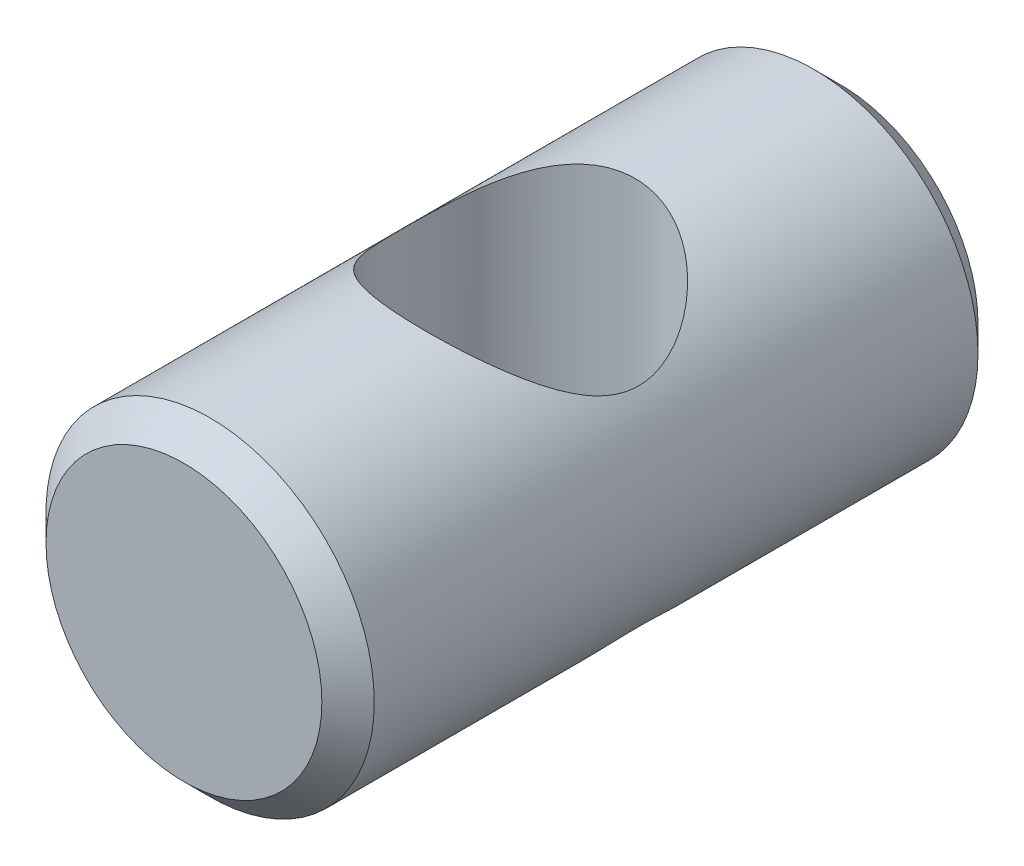
ISO-10303-21;
HEADER;
FILE_DESCRIPTION(('STEP AP214'),'2;1');
FILE_NAME('part.step','',(''),(''),'','','');
FILE_SCHEMA(('AUTOMOTIVE_DESIGN { 1 0 10303 214 1 1 1 1 }'));
ENDSEC;
DATA;
#1=APPLICATION_CONTEXT('core data for automotive mechanical design processes');
#2=APPLICATION_PROTOCOL_DEFINITION('international standard','automotive_design',2000,#1);
#3=PRODUCT_CONTEXT('',#1,'mechanical');
#4=PRODUCT('Part','Part','',(#3));
#5=PRODUCT_RELATED_PRODUCT_CATEGORY('part','',(#4));
#6=PRODUCT_DEFINITION_FORMATION('','',#4);
#7=PRODUCT_DEFINITION_CONTEXT('part definition',#1,'design');
#8=PRODUCT_DEFINITION('design','',#6,#7);
#9=PRODUCT_DEFINITION_SHAPE('','',#8);
#10=(LENGTH_UNIT() NAMED_UNIT(*) SI_UNIT(.MILLI.,.METRE.));
#11=(NAMED_UNIT(*) PLANE_ANGLE_UNIT() SI_UNIT($,.RADIAN.));
#12=(NAMED_UNIT(*) SI_UNIT($,.STERADIAN.) SOLID_ANGLE_UNIT());
#13=UNCERTAINTY_MEASURE_WITH_UNIT(LENGTH_MEASURE(1.E-05),#10,'distance_accuracy_value','');
#14=(GEOMETRIC_REPRESENTATION_CONTEXT(3) GLOBAL_UNCERTAINTY_ASSIGNED_CONTEXT((#13)) GLOBAL_UNIT_ASSIGNED_CONTEXT((#10,
#11,#12)) REPRESENTATION_CONTEXT('',''));
#15=CARTESIAN_POINT('',(0.,0.,0.));
#16=DIRECTION('',(0.,0.,1.));
#17=DIRECTION('',(1.,0.,0.));
#18=AXIS2_PLACEMENT_3D('',#15,#16,#17);
#19=CARTESIAN_POINT('',(0.,0.,9.525));
#20=DIRECTION('',(0.,0.,-1.));
#21=DIRECTION('',(-1.,0.,0.));
#22=AXIS2_PLACEMENT_3D('',#19,#20,#21);
#23=CYLINDRICAL_SURFACE('',#22,4.765);
#24=CARTESIAN_POINT('',(0.,-4.765,-3.42087708051605));
#25=CARTESIAN_POINT('',(-0.0856942510059222,-4.76500372406179,-3.41461845405845));
#26=CARTESIAN_POINT('',(-0.171121100206974,-4.76268528674186,-3.40513185664893));
#27=CARTESIAN_POINT('',(-0.340815163949196,-4.75355458297263,-3.3798209799213));
#28=CARTESIAN_POINT('',(-0.425082157083863,-4.74674147034843,-3.36399550745666));
#29=CARTESIAN_POINT('',(-0.591815819068765,-4.72884919919637,-3.32619287103985));
#30=CARTESIAN_POINT('',(-0.674281275080604,-4.71776725496124,-3.30421169262714));
#31=CARTESIAN_POINT('',(-0.836795481484615,-4.69167199758972,-3.25438345334717));
#32=CARTESIAN_POINT('',(-0.916843174546032,-4.67665699144282,-3.22653386740008));
#33=CARTESIAN_POINT('',(-1.15161088782801,-4.62649388533987,-3.13503201933925));
#34=CARTESIAN_POINT('',(-1.30210455493484,-4.58609564145861,-3.06316075101044));
#35=CARTESIAN_POINT('',(-1.58863168547318,-4.49490342184667,-2.90027011950621));
#36=CARTESIAN_POINT('',(-1.72466521273604,-4.44410949200855,-2.8092508408611));
#37=CARTESIAN_POINT('',(-1.99344316901954,-4.33066983387455,-2.60068581749612));
#38=CARTESIAN_POINT('',(-2.12455950948192,-4.26735049915497,-2.48141483397178));
#39=CARTESIAN_POINT('',(-2.36662844877739,-4.13801271400532,-2.22471339631872));
#40=CARTESIAN_POINT('',(-2.47754400950904,-4.07198957219361,-2.0872503679407));
#41=CARTESIAN_POINT('',(-2.63522008426459,-3.97058736699203,-1.85762881960823));
#42=CARTESIAN_POINT('',(-2.68927381649975,-3.93405791672857,-1.77089868261764));
#43=CARTESIAN_POINT('',(-2.7898123672948,-3.86341055651136,-1.59215475247703));
#44=CARTESIAN_POINT('',(-2.8362953611804,-3.82929322903742,-1.50013969277935));
#45=CARTESIAN_POINT('',(-2.92109506219807,-3.76500433588578,-1.31138394914416));
#46=CARTESIAN_POINT('',(-2.95943224889948,-3.73482295044036,-1.21465588622808));
#47=CARTESIAN_POINT('',(-3.02751038617565,-3.67985289464928,-1.01675067628099));
#48=CARTESIAN_POINT('',(-3.05725266863841,-3.65506338891177,-0.915574221386684));
#49=CARTESIAN_POINT('',(-3.11687147939033,-3.6045001534632,-0.67099477241958));
#50=CARTESIAN_POINT('',(-3.1426716573391,-3.58179904614131,-0.525900399043322));
#51=CARTESIAN_POINT('',(-3.17531879928658,-3.55289761873413,-0.232127458475882));
#52=CARTESIAN_POINT('',(-3.18219321735307,-3.54667339746892,-0.0834543989750653));
#53=CARTESIAN_POINT('',(-3.17657749143383,-3.55170212546434,0.213317287341349));
#54=CARTESIAN_POINT('',(-3.16407499232303,-3.56296622565023,0.361415487241703));
#55=CARTESIAN_POINT('',(-3.12052786613102,-3.60115736376545,0.652864674015799));
#56=CARTESIAN_POINT('',(-3.08945551925451,-3.62810781563299,0.796208225157674));
#57=CARTESIAN_POINT('',(-2.99939551024929,-3.7031254731471,1.113834133153));
#58=CARTESIAN_POINT('',(-2.935059493251,-3.75497411677657,1.28568810104235));
#59=CARTESIAN_POINT('',(-2.78193078819236,-3.86978306225472,1.61407604920641));
#60=CARTESIAN_POINT('',(-2.69310335851004,-3.93275910264603,1.77058783551896));
#61=CARTESIAN_POINT('',(-2.4912979885232,-4.06367063457592,2.0696195035013));
#62=CARTESIAN_POINT('',(-2.37789966570814,-4.13167682450423,2.21182316788456));
#63=CARTESIAN_POINT('',(-2.12925717522725,-4.2651343082136,2.47731111793097));
#64=CARTESIAN_POINT('',(-1.99400822055652,-4.33058503823793,2.60059124628564));
#65=CARTESIAN_POINT('',(-1.7670573834392,-4.42612763761141,2.77615470390877));
#66=CARTESIAN_POINT('',(-1.6822445834248,-4.45914566450104,2.83587617597991));
#67=CARTESIAN_POINT('',(-1.50659920639215,-4.52150995180942,2.947896944092));
#68=CARTESIAN_POINT('',(-1.41576961857281,-4.55085801488201,3.00019988575807));
#69=CARTESIAN_POINT('',(-1.22866881482431,-4.60489675490913,3.09669333580216));
#70=CARTESIAN_POINT('',(-1.13240204741352,-4.62959116958818,3.14089035393789));
#71=CARTESIAN_POINT('',(-0.935098556820256,-4.67343743710795,3.22051991832548));
#72=CARTESIAN_POINT('',(-0.834063119610056,-4.69259077439564,3.25595481156827));
#73=CARTESIAN_POINT('',(-0.643011205494899,-4.72225783820339,3.31298838642537));
#74=CARTESIAN_POINT('',(-0.553499932720004,-4.73361796210781,3.33584407298325));
#75=CARTESIAN_POINT('',(-0.372452914467137,-4.75129170146378,3.37431676551974));
#76=CARTESIAN_POINT('',(-0.280917553453982,-4.75760626697296,3.38993513402243));
#77=CARTESIAN_POINT('',(-0.09673711161572,-4.76490794866924,3.41369053940287));
#78=CARTESIAN_POINT('',(-0.00409298485153118,-4.7658993553638,3.42183359704886));
#79=CARTESIAN_POINT('',(0.181418156766346,-4.76245075257906,3.43057334885341));
#80=CARTESIAN_POINT('',(0.274285147372989,-4.75801130940609,3.4311708297596));
#81=CARTESIAN_POINT('',(0.525402140212855,-4.73860365154558,3.42259332577953));
#82=CARTESIAN_POINT('',(0.683080399868527,-4.71838660580482,3.40615014047491));
#83=CARTESIAN_POINT('',(0.992055912085098,-4.66323470196912,3.35244843254439));
#84=CARTESIAN_POINT('',(1.14335212857024,-4.62829746420291,3.31518654404212));
#85=CARTESIAN_POINT('',(1.44037093529811,-4.54477683855939,3.22069256193487));
#86=CARTESIAN_POINT('',(1.58583077351322,-4.49584879234044,3.16294586849736));
#87=CARTESIAN_POINT('',(1.86441880924205,-4.38765715004444,3.03024615278744));
#88=CARTESIAN_POINT('',(1.99754518152055,-4.32839202790804,2.95529058945734));
#89=CARTESIAN_POINT('',(2.27097103888529,-4.19224174473938,2.77694263666353));
#90=CARTESIAN_POINT('',(2.40888984782925,-4.11405974263684,2.67090512984919));
#91=CARTESIAN_POINT('',(2.66587906112291,-3.95239056473024,2.44095262310581));
#92=CARTESIAN_POINT('',(2.78491038380749,-3.86889287710437,2.3170015431911));
#93=CARTESIAN_POINT('',(2.95944836917975,-3.73546390997119,2.10578327830163));
#94=CARTESIAN_POINT('',(3.02130520302377,-3.68548107882744,2.0237036190676));
#95=CARTESIAN_POINT('',(3.13777568238829,-3.58683785296792,1.85371866080111));
#96=CARTESIAN_POINT('',(3.19238662314116,-3.53817795744017,1.76581120461187));
#97=CARTESIAN_POINT('',(3.29391986716952,-3.44385098338172,1.5843730656778));
#98=CARTESIAN_POINT('',(3.34085609211771,-3.39817857804186,1.49085299510459));
#99=CARTESIAN_POINT('',(3.42662377857565,-3.31167359664885,1.29810668122894));
#100=CARTESIAN_POINT('',(3.46546161115912,-3.27083722705749,1.19888500242191));
#101=CARTESIAN_POINT('',(3.54120497188103,-3.18885516595158,0.974440490747446));
#102=CARTESIAN_POINT('',(3.57619062301583,-3.1492626339122,0.847970637553341));
#103=CARTESIAN_POINT('',(3.63174972945767,-3.08503730320172,0.588391612874332));
#104=CARTESIAN_POINT('',(3.65235728655054,-3.06036912574003,0.455298958800161));
#105=CARTESIAN_POINT('',(3.67777071315275,-3.02979706874601,0.184194545370656));
#106=CARTESIAN_POINT('',(3.68244175304891,-3.02405331165103,0.0461507501936488));
#107=CARTESIAN_POINT('',(3.6751244389998,-3.03293601525137,-0.228869006794241));
#108=CARTESIAN_POINT('',(3.66312499986099,-3.0475760303441,-0.365844197101763));
#109=CARTESIAN_POINT('',(3.62122925120973,-3.09726630105768,-0.650230171928317));
#110=CARTESIAN_POINT('',(3.58937336547909,-3.13453780226407,-0.796943421401725));
#111=CARTESIAN_POINT('',(3.508654337231,-3.22462114118857,-1.08072293758561));
#112=CARTESIAN_POINT('',(3.45974705679342,-3.27747325429306,-1.21776304727642));
#113=CARTESIAN_POINT('',(3.36301407675573,-3.37619758620276,-1.44380487587525));
#114=CARTESIAN_POINT('',(3.31880941649885,-3.41980345352406,-1.53541472914784));
#115=CARTESIAN_POINT('',(3.22318686460508,-3.51007278340862,-1.71325899124101));
#116=CARTESIAN_POINT('',(3.17176598967204,-3.55673750627696,-1.79949115543573));
#117=CARTESIAN_POINT('',(3.06199483422709,-3.65166911402979,-1.96661914900773));
#118=CARTESIAN_POINT('',(3.00363765010073,-3.69993756007587,-2.04750953513389));
#119=CARTESIAN_POINT('',(2.88022236229035,-3.79680115463074,-2.20380218805043));
#120=CARTESIAN_POINT('',(2.81516393657853,-3.84539631873498,-2.27920419079938));
#121=CARTESIAN_POINT('',(2.67676457623467,-3.94303263591416,-2.4261391389075));
#122=CARTESIAN_POINT('',(2.60325744667227,-3.99205464797062,-2.49752854458933));
#123=CARTESIAN_POINT('',(2.44945432768786,-4.0882302310309,-2.63398346451988));
#124=CARTESIAN_POINT('',(2.36915847098096,-4.13538383853433,-2.69904910234064));
#125=CARTESIAN_POINT('',(2.20207272913392,-4.22671789334807,-2.82224391386082));
#126=CARTESIAN_POINT('',(2.11529478200157,-4.27090353485644,-2.88038535111654));
#127=CARTESIAN_POINT('',(1.9354015778796,-4.35537950017704,-2.98921049190835));
#128=CARTESIAN_POINT('',(1.84228618810119,-4.3956697423259,-3.03989403910843));
#129=CARTESIAN_POINT('',(1.60007775045864,-4.49105515072698,-3.15729530247129));
#130=CARTESIAN_POINT('',(1.44704004279908,-4.54296413284264,-3.21865913496703));
#131=CARTESIAN_POINT('',(1.12993645286048,-4.63200684267677,-3.3193657103388));
#132=CARTESIAN_POINT('',(0.965887162825332,-4.66916224170543,-3.35874078699293));
#133=CARTESIAN_POINT('',(0.667836753392529,-4.7198321934562,-3.40702933763492));
#134=CARTESIAN_POINT('',(0.535175413725972,-4.73675120565746,-3.42074184495159));
#135=CARTESIAN_POINT('',(0.268125701070823,-4.75933258257015,-3.43254995015108));
#136=CARTESIAN_POINT('',(0.133737212222471,-4.76499418810905,-3.43064449484029));
#137=CARTESIAN_POINT('',(0.,-4.765,-3.42087708051605));
#138=B_SPLINE_CURVE_WITH_KNOTS('',3,(#24,#25,#26,#27,#28,#29,#30,#31,#32,#33,#34,#35,#36,#37,
#38,#39,#40,#41,#42,#43,#44,#45,#46,#47,#48,#49,#50,#51,#52,#53,#54,#55,#56,#57,#58,#59,#60,#61,
#62,#63,#64,#65,#66,#67,#68,#69,#70,#71,#72,#73,#74,#75,#76,#77,#78,#79,#80,#81,#82,#83,#84,#85,
#86,#87,#88,#89,#90,#91,#92,#93,#94,#95,#96,#97,#98,#99,#100,#101,#102,#103,#104,#105,#106,#107,
#108,#109,#110,#111,#112,#113,#114,#115,#116,#117,#118,#119,#120,#121,#122,#123,#124,#125,#126,
#127,#128,#129,#130,#131,#132,#133,#134,#135,#136,#137),.UNSPECIFIED.,.T.,.F.,(4,2,2,2,2,2,2,2,
2,2,2,2,2,2,2,2,2,2,2,2,2,2,2,2,2,2,2,2,2,2,2,2,2,2,2,2,2,2,2,2,2,2,2,2,2,2,2,2,2,2,2,2,2,2,2,2,
4),(0.,0.257622698048237,0.515293910411776,0.773133556664686,1.03108437448132,1.54347148068929,
2.05585632497401,2.61844275267492,3.18205051961308,3.50728342339531,3.83259459810832,
4.1570779608603,4.48151101385633,4.92678697222646,5.37141666361017,5.81632997678325,
6.26190909071532,6.83091206396529,7.40072637063391,7.98119155491015,8.5617840795358,
8.88795315539233,9.21396138526207,9.53970664481247,9.86536455667517,10.1441842796833,
10.4229514897185,10.7014939774448,10.9800074224004,11.4570142229675,11.9340981662222,
12.4241316247447,12.9142374880829,13.4844043505898,14.0557360264669,14.3982708931589,
14.7409332646616,15.0829669920992,15.4247306149621,15.8344527346029,16.2431997463018,
16.655396466846,17.0678674127493,17.5294161680566,17.9921686334037,18.3237849761703,
18.6555388204231,18.9876256640975,19.3197284736399,19.6601202402325,20.0005053539297,
20.3402783466007,20.6800584607475,21.1964020749097,21.7119844090775,22.1140115905448,
22.5160658828429),.UNSPECIFIED.);
#139=CARTESIAN_POINT('',(0.,-4.765,-3.42087708051605));
#140=VERTEX_POINT('',#139);
#141=EDGE_CURVE('E10',#140,#140,#138,.T.);
#142=ORIENTED_EDGE('',*,*,#141,.T.);
#143=EDGE_LOOP('',(#142));
#144=FACE_BOUND('',#143,.T.);
#145=CARTESIAN_POINT('',(0.25,4.75843724346555,3.43));
#146=CARTESIAN_POINT('',(0.166724112169052,4.76281167621829,3.42999922787093));
#147=CARTESIAN_POINT('',(0.0833091871232495,4.76499730659661,3.42696170981832));
#148=CARTESIAN_POINT('',(-0.0831121740296209,4.7650026918208,3.4148068467804));
#149=CARTESIAN_POINT('',(-0.166118334391627,4.76281982101014,3.40568584755888));
#150=CARTESIAN_POINT('',(-0.331186959790398,4.75419585970188,3.38143299325718));
#151=CARTESIAN_POINT('',(-0.413247381645857,4.74774685395692,3.36628998600944));
#152=CARTESIAN_POINT('',(-0.57566379669092,4.7308054983668,3.33018248201757));
#153=CARTESIAN_POINT('',(-0.656019036141793,4.72031139819935,3.30921546630946));
#154=CARTESIAN_POINT('',(-0.892787966377315,4.68332033908369,3.23819654976144));
#155=CARTESIAN_POINT('',(-1.04595137150619,4.65125389258668,3.17986930590837));
#156=CARTESIAN_POINT('',(-1.33984014973707,4.57527843427845,3.04361904551389));
#157=CARTESIAN_POINT('',(-1.48056835886066,4.5313721320163,2.96570051271122));
#158=CARTESIAN_POINT('',(-1.75788689740451,4.43151908585651,2.78614227044201));
#159=CARTESIAN_POINT('',(-1.89336529725832,4.37491413457117,2.68315702445496));
#160=CARTESIAN_POINT('',(-2.14655524443234,4.25642076403591,2.45967503555252));
#161=CARTESIAN_POINT('',(-2.26424375736879,4.1945256545925,2.33915597919725));
#162=CARTESIAN_POINT('',(-2.49954291256701,4.05942448373215,2.06004986641745));
#163=CARTESIAN_POINT('',(-2.61358783923186,3.98612152048065,1.89848678532065));
#164=CARTESIAN_POINT('',(-2.8134167940547,3.84768475167639,1.55552772477578));
#165=CARTESIAN_POINT('',(-2.8992289351292,3.78254285998121,1.37415171538823));
#166=CARTESIAN_POINT('',(-3.02121659224799,3.68536960684574,1.04249027419633));
#167=CARTESIAN_POINT('',(-3.06446847823432,3.64913089405156,0.896059930245661));
#168=CARTESIAN_POINT('',(-3.13130443601069,3.59195313084762,0.59599414502253));
#169=CARTESIAN_POINT('',(-3.15492488386826,3.57098579230857,0.442372589402983));
#170=CARTESIAN_POINT('',(-3.18107400515714,3.54772325730842,0.130968163534104));
#171=CARTESIAN_POINT('',(-3.18348141023251,3.54553541923722,-0.0268334663617299));
#172=CARTESIAN_POINT('',(-3.16668321345997,3.56054009581889,-0.340378540732283));
#173=CARTESIAN_POINT('',(-3.14746550747579,3.57774346424277,-0.4961207831265));
#174=CARTESIAN_POINT('',(-3.0909210961652,3.62666135115865,-0.789904337023396));
#175=CARTESIAN_POINT('',(-3.05498661482471,3.65725103780533,-0.928415250197683));
#176=CARTESIAN_POINT('',(-2.96728528802359,3.72875878634848,-1.19751261050963));
#177=CARTESIAN_POINT('',(-2.91550550146166,3.76968528568752,-1.3280924753778));
#178=CARTESIAN_POINT('',(-2.77052705474689,3.87825771410624,-1.63782460440973));
#179=CARTESIAN_POINT('',(-2.66921327673824,3.9495685015488,-1.81191316545693));
#180=CARTESIAN_POINT('',(-2.4387535532021,4.09590072272998,-2.13907509935082));
#181=CARTESIAN_POINT('',(-2.30955797140353,4.17092858781235,-2.29211018589258));
#182=CARTESIAN_POINT('',(-2.02402160906534,4.31676779733467,-2.57575490113864));
#183=CARTESIAN_POINT('',(-1.86747364912315,4.38754097750563,-2.70617703034937));
#184=CARTESIAN_POINT('',(-1.53024851972964,4.51618771874562,-2.93894144764791));
#185=CARTESIAN_POINT('',(-1.34962456620741,4.57408899880651,-3.04134418612298));
#186=CARTESIAN_POINT('',(-1.01242767734236,4.65865916827853,-3.19328266988702));
#187=CARTESIAN_POINT('',(-0.85992332344972,4.68945201631652,-3.24956507034397));
#188=CARTESIAN_POINT('',(-0.546356902825548,4.73621910160439,-3.34025251275025));
#189=CARTESIAN_POINT('',(-0.385300834260464,4.75220358398007,-3.37467267483606));
#190=CARTESIAN_POINT('',(-0.0585909892563556,4.76745293508549,-3.42008033355065));
#191=CARTESIAN_POINT('',(0.107075469726218,4.76666592499011,-3.43099500658852));
#192=CARTESIAN_POINT('',(0.437263524427023,4.74777547003753,-3.42886170148299));
#193=CARTESIAN_POINT('',(0.601785009912756,4.72967038048901,-3.41581144729144));
#194=CARTESIAN_POINT('',(0.917023455984583,4.67852691536303,-3.36811701365221));
#195=CARTESIAN_POINT('',(1.06802543846496,4.64623395849401,-3.33452146005276));
#196=CARTESIAN_POINT('',(1.36114282577409,4.56897312306875,-3.2486320258752));
#197=CARTESIAN_POINT('',(1.5032561767415,4.52400232821754,-3.19633384236941));
#198=CARTESIAN_POINT('',(1.78918123830801,4.41920416422592,-3.06961312822602));
#199=CARTESIAN_POINT('',(1.93190566387653,4.35837989651048,-2.99357734594169));
#200=CARTESIAN_POINT('',(2.20254689954151,4.22807467175417,-2.82452841204479));
#201=CARTESIAN_POINT('',(2.3304539546229,4.15858807365445,-2.73150417873574));
#202=CARTESIAN_POINT('',(2.59396805594881,4.00055978130538,-2.51111133608925));
#203=CARTESIAN_POINT('',(2.72627669731259,3.9109325153004,-2.38058009592622));
#204=CARTESIAN_POINT('',(2.96812567159531,3.73070877587188,-2.100243948315));
#205=CARTESIAN_POINT('',(3.07764472575726,3.64011147895989,-1.95042123769023));
#206=CARTESIAN_POINT('',(3.25959426369705,3.47751484837525,-1.65330676505373));
#207=CARTESIAN_POINT('',(3.33502083401563,3.40464496946818,-1.50833136837071));
#208=CARTESIAN_POINT('',(3.46586658517559,3.2713441238456,-1.20430907278381));
#209=CARTESIAN_POINT('',(3.52132872734755,3.21088656913652,-1.04529331737332));
#210=CARTESIAN_POINT('',(3.59765604252707,3.124823861218,-0.757665304054352));
#211=CARTESIAN_POINT('',(3.62377560920146,3.09423907936361,-0.631975559150281));
#212=CARTESIAN_POINT('',(3.66180814769204,3.04914510271432,-0.375721470658428));
#213=CARTESIAN_POINT('',(3.67374715513707,3.03460645057289,-0.245166515787295));
#214=CARTESIAN_POINT('',(3.68248381420053,3.02400445245463,0.0177966534529435));
#215=CARTESIAN_POINT('',(3.67921741545453,3.02801925946825,0.150210360703107));
#216=CARTESIAN_POINT('',(3.65769938197026,3.0539665857314,0.412078573372208));
#217=CARTESIAN_POINT('',(3.63942784679228,3.07592289956546,0.54152891416466));
#218=CARTESIAN_POINT('',(3.58281700309049,3.14180670904453,0.826729712346176));
#219=CARTESIAN_POINT('',(3.54052764492096,3.18993005386834,0.980691312065217));
#220=CARTESIAN_POINT('',(3.43738681858182,3.30080253377366,1.2767906566915));
#221=CARTESIAN_POINT('',(3.37648537626474,3.36359093675505,1.41889524108079));
#222=CARTESIAN_POINT('',(3.25927230939949,3.4766169791788,1.64936888169118));
#223=CARTESIAN_POINT('',(3.20719498221027,3.52486634365835,1.7409394575126));
#224=CARTESIAN_POINT('',(3.09541954727663,3.62341667346676,1.91819495195357));
#225=CARTESIAN_POINT('',(3.03571875143679,3.67371835818199,2.0038777780348));
#226=CARTESIAN_POINT('',(2.90891804374965,3.77491865704642,2.16931406665596));
#227=CARTESIAN_POINT('',(2.84181267646787,3.82581768629146,2.24906308395903));
#228=CARTESIAN_POINT('',(2.70038920437342,3.92691720618762,2.40236682455076));
#229=CARTESIAN_POINT('',(2.62607150215374,3.9771177356504,2.47592189315842));
#230=CARTESIAN_POINT('',(2.46949972376397,4.0762079661732,2.61724277483524));
#231=CARTESIAN_POINT('',(2.38716864979552,4.1250776725309,2.68493753880603));
#232=CARTESIAN_POINT('',(2.21541256265412,4.21980975535666,2.81310096557156));
#233=CARTESIAN_POINT('',(2.1259865725645,4.26567171608716,2.87356863036593));
#234=CARTESIAN_POINT('',(1.94048293416797,4.35318701528819,2.98645656939565));
#235=CARTESIAN_POINT('',(1.8444179349447,4.39484800441004,3.03889156631573));
#236=CARTESIAN_POINT('',(1.64605779138663,4.47292957405361,3.1349771488852));
#237=CARTESIAN_POINT('',(1.54376590080899,4.50935285855684,3.17863227184576));
#238=CARTESIAN_POINT('',(1.28981920639204,4.58975257088417,3.27242101077825));
#239=CARTESIAN_POINT('',(1.1352862763967,4.63059676914717,3.31773285408371));
#240=CARTESIAN_POINT('',(0.897902839073421,4.68033819384841,3.36922808334745));
#241=CARTESIAN_POINT('',(0.817919413239364,4.69498977614935,3.38364210754006));
#242=CARTESIAN_POINT('',(0.65651498283896,4.7202607906775,3.4067980569507));
#243=CARTESIAN_POINT('',(0.575094809436486,4.73088247904069,3.41554315786432));
#244=CARTESIAN_POINT('',(0.452884075948464,4.74360353870641,3.42423436805334));
#245=CARTESIAN_POINT('',(0.412398045833619,4.74729478081944,3.42639368476122));
#246=CARTESIAN_POINT('',(0.331285742741573,4.75364382663165,3.42927683030824));
#247=CARTESIAN_POINT('',(0.29065944377002,4.7563014271186,3.43000037699194));
#248=CARTESIAN_POINT('',(0.25,4.75843724346555,3.43));
#249=B_SPLINE_CURVE_WITH_KNOTS('',3,(#145,#146,#147,#148,#149,#150,#151,#152,#153,#154,#155,
#156,#157,#158,#159,#160,#161,#162,#163,#164,#165,#166,#167,#168,#169,#170,#171,#172,#173,#174,
#175,#176,#177,#178,#179,#180,#181,#182,#183,#184,#185,#186,#187,#188,#189,#190,#191,#192,#193,
#194,#195,#196,#197,#198,#199,#200,#201,#202,#203,#204,#205,#206,#207,#208,#209,#210,#211,#212,
#213,#214,#215,#216,#217,#218,#219,#220,#221,#222,#223,#224,#225,#226,#227,#228,#229,#230,#231,
#232,#233,#234,#235,#236,#237,#238,#239,#240,#241,#242,#243,#244,#245,#246,#247,#248),
.UNSPECIFIED.,.T.,.F.,(4,2,2,2,2,2,2,2,2,2,2,2,2,2,2,2,2,2,2,2,2,2,2,2,2,2,2,2,2,2,2,2,2,2,2,2,
2,2,2,2,2,2,2,2,2,2,2,2,2,2,2,4),(0.,0.250128749904401,0.500407883064132,0.751152683255352,
1.00200610335284,1.5005745207861,1.99902893760549,2.53506428284883,3.0717878497701,
3.7017577007417,4.33109834451233,4.80006775596797,5.26816624101772,5.73893897524922,
6.20997534433429,6.64735102377689,7.08508487226794,7.72280008470008,8.36166008801208,
9.005587331222,9.64811417987125,10.1423678843309,10.636279384842,11.1317189102055,
11.6272054919413,12.0992981890247,12.5714995707697,13.0879217874425,13.6046820813895,
14.2214259135373,14.8387430440107,15.3739112332421,15.9079208139713,16.3022952653858,
16.6959445170977,17.0912534507832,17.4870875080064,17.9846304730143,18.483521274847,
18.8307287538684,19.1780590008212,19.5256468793742,19.8732153666977,20.2245350343439,
20.5759031603044,20.926619370564,21.2771538674155,21.7730640559323,22.0205706255639,
22.2679384234592,22.3900397673761,22.512165104096),.UNSPECIFIED.);
#250=CARTESIAN_POINT('',(0.25,4.75843724346555,3.43));
#251=VERTEX_POINT('',#250);
#252=EDGE_CURVE('E57',#251,#251,#249,.T.);
#253=ORIENTED_EDGE('',*,*,#252,.T.);
#254=EDGE_LOOP('',(#253));
#255=FACE_BOUND('',#254,.T.);
#256=CARTESIAN_POINT('',(0.,0.,-8.76499999999999));
#257=DIRECTION('',(0.,0.,1.));
#258=DIRECTION('',(1.,0.,0.));
#259=AXIS2_PLACEMENT_3D('',#256,#257,#258);
#260=CIRCLE('',#259,4.765);
#261=CARTESIAN_POINT('',(4.765,0.,-8.76499999999999));
#262=VERTEX_POINT('',#261);
#263=EDGE_CURVE('E100',#262,#262,#260,.T.);
#264=ORIENTED_EDGE('',*,*,#263,.T.);
#265=EDGE_LOOP('',(#264));
#266=FACE_BOUND('',#265,.T.);
#267=CARTESIAN_POINT('',(0.,0.,8.76500000000001));
#268=DIRECTION('',(0.,0.,1.));
#269=DIRECTION('',(1.,0.,0.));
#270=AXIS2_PLACEMENT_3D('',#267,#268,#269);
#271=CIRCLE('',#270,4.765);
#272=CARTESIAN_POINT('',(4.765,0.,8.76500000000001));
#273=VERTEX_POINT('',#272);
#274=EDGE_CURVE('E103',#273,#273,#271,.F.);
#275=ORIENTED_EDGE('',*,*,#274,.T.);
#276=EDGE_LOOP('',(#275));
#277=FACE_BOUND('',#276,.T.);
#278=ADVANCED_FACE('F43',(#144,#255,#266,#277),#23,.T.);
#279=CARTESIAN_POINT('',(0.,0.,9.525));
#280=DIRECTION('',(0.,0.,1.));
#281=DIRECTION('',(1.,0.,0.));
#282=AXIS2_PLACEMENT_3D('',#279,#280,#281);
#283=PLANE('',#282);
#284=CARTESIAN_POINT('',(0.,0.,9.525));
#285=DIRECTION('',(0.,0.,1.));
#286=DIRECTION('',(1.,0.,0.));
#287=AXIS2_PLACEMENT_3D('',#284,#285,#286);
#288=CIRCLE('',#287,4.00500000000001);
#289=CARTESIAN_POINT('',(4.00500000000001,0.,9.525));
#290=VERTEX_POINT('',#289);
#291=EDGE_CURVE('E62',#290,#290,#288,.T.);
#292=ORIENTED_EDGE('',*,*,#291,.T.);
#293=EDGE_LOOP('',(#292));
#294=FACE_BOUND('',#293,.T.);
#295=ADVANCED_FACE('F80',(#294),#283,.T.);
#296=CARTESIAN_POINT('',(0.,0.,-9.525));
#297=DIRECTION('',(0.,0.,1.));
#298=DIRECTION('',(1.,0.,0.));
#299=AXIS2_PLACEMENT_3D('',#296,#297,#298);
#300=PLANE('',#299);
#301=CARTESIAN_POINT('',(0.,0.,-9.525));
#302=DIRECTION('',(0.,0.,1.));
#303=DIRECTION('',(1.,0.,0.));
#304=AXIS2_PLACEMENT_3D('',#301,#302,#303);
#305=CIRCLE('',#304,4.00499999999998);
#306=CARTESIAN_POINT('',(4.00499999999998,0.,-9.525));
#307=VERTEX_POINT('',#306);
#308=EDGE_CURVE('E67',#307,#307,#305,.F.);
#309=ORIENTED_EDGE('',*,*,#308,.T.);
#310=EDGE_LOOP('',(#309));
#311=FACE_BOUND('',#310,.T.);
#312=ADVANCED_FACE('F83',(#311),#300,.F.);
#313=CARTESIAN_POINT('',(0.,0.,-8.76499999999999));
#314=DIRECTION('',(0.,0.,1.));
#315=DIRECTION('',(1.,0.,0.));
#316=AXIS2_PLACEMENT_3D('',#313,#314,#315);
#317=CONICAL_SURFACE('',#316,4.765,0.785398163397451);
#318=ORIENTED_EDGE('',*,*,#308,.F.);
#319=EDGE_LOOP('',(#318));
#320=FACE_BOUND('',#319,.T.);
#321=ORIENTED_EDGE('',*,*,#263,.F.);
#322=EDGE_LOOP('',(#321));
#323=FACE_BOUND('',#322,.T.);
#324=ADVANCED_FACE('F86',(#320,#323),#317,.T.);
#325=CARTESIAN_POINT('',(0.,0.,9.525));
#326=DIRECTION('',(0.,0.,-1.));
#327=DIRECTION('',(-1.,0.,0.));
#328=AXIS2_PLACEMENT_3D('',#325,#326,#327);
#329=CONICAL_SURFACE('',#328,4.00500000000001,0.785398163397448);
#330=ORIENTED_EDGE('',*,*,#274,.F.);
#331=EDGE_LOOP('',(#330));
#332=FACE_BOUND('',#331,.T.);
#333=ORIENTED_EDGE('',*,*,#291,.F.);
#334=EDGE_LOOP('',(#333));
#335=FACE_BOUND('',#334,.T.);
#336=ADVANCED_FACE('F46',(#332,#335),#329,.T.);
#337=CARTESIAN_POINT('',(0.25,-4.765,0.));
#338=DIRECTION('',(0.,1.,0.));
#339=DIRECTION('',(0.,0.,1.));
#340=AXIS2_PLACEMENT_3D('',#337,#338,#339);
#341=CYLINDRICAL_SURFACE('',#340,3.43);
#342=ORIENTED_EDGE('',*,*,#252,.F.);
#343=EDGE_LOOP('',(#342));
#344=FACE_BOUND('',#343,.T.);
#345=ORIENTED_EDGE('',*,*,#141,.F.);
#346=EDGE_LOOP('',(#345));
#347=FACE_BOUND('',#346,.T.);
#348=ADVANCED_FACE('F75',(#344,#347),#341,.F.);
#349=CLOSED_SHELL('',(#278,#295,#312,#324,#336,#348));
#350=MANIFOLD_SOLID_BREP('B2',#349);
#351=ADVANCED_BREP_SHAPE_REPRESENTATION('',(#18,#350),#14);
#352=SHAPE_DEFINITION_REPRESENTATION(#9,#351);
ENDSEC;
END-ISO-10303-21;
